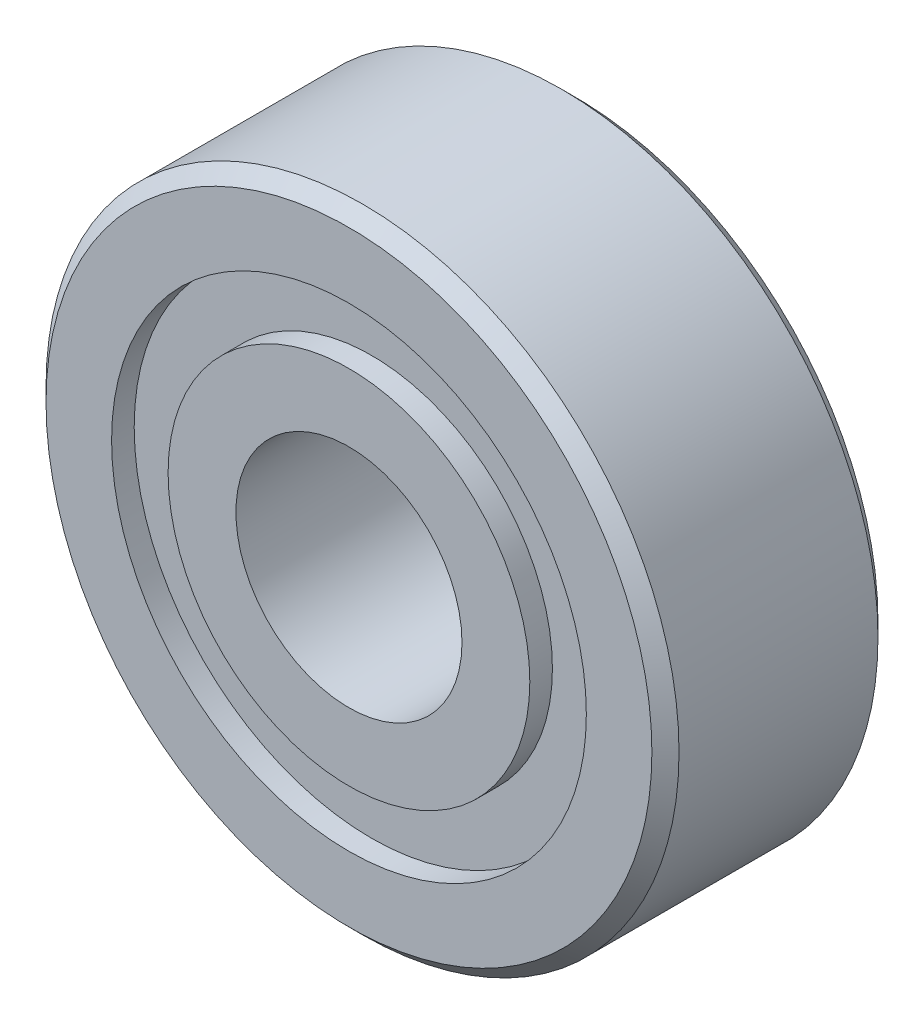
ISO-10303-21;
HEADER;
FILE_DESCRIPTION(('STEP AP214'),'2;1');
FILE_NAME('part.step','',(''),(''),'','','');
FILE_SCHEMA(('AUTOMOTIVE_DESIGN { 1 0 10303 214 1 1 1 1 }'));
ENDSEC;
DATA;
#1=APPLICATION_CONTEXT('core data for automotive mechanical design processes');
#2=APPLICATION_PROTOCOL_DEFINITION('international standard','automotive_design',2000,#1);
#3=PRODUCT_CONTEXT('',#1,'mechanical');
#4=PRODUCT('Part','Part','',(#3));
#5=PRODUCT_RELATED_PRODUCT_CATEGORY('part','',(#4));
#6=PRODUCT_DEFINITION_FORMATION('','',#4);
#7=PRODUCT_DEFINITION_CONTEXT('part definition',#1,'design');
#8=PRODUCT_DEFINITION('design','',#6,#7);
#9=PRODUCT_DEFINITION_SHAPE('','',#8);
#10=(LENGTH_UNIT() NAMED_UNIT(*) SI_UNIT(.MILLI.,.METRE.));
#11=(NAMED_UNIT(*) PLANE_ANGLE_UNIT() SI_UNIT($,.RADIAN.));
#12=(NAMED_UNIT(*) SI_UNIT($,.STERADIAN.) SOLID_ANGLE_UNIT());
#13=UNCERTAINTY_MEASURE_WITH_UNIT(LENGTH_MEASURE(1.E-05),#10,'distance_accuracy_value','');
#14=(GEOMETRIC_REPRESENTATION_CONTEXT(3) GLOBAL_UNCERTAINTY_ASSIGNED_CONTEXT((#13)) GLOBAL_UNIT_ASSIGNED_CONTEXT((#10,
#11,#12)) REPRESENTATION_CONTEXT('',''));
#15=CARTESIAN_POINT('',(0.,0.,0.));
#16=DIRECTION('',(0.,0.,1.));
#17=DIRECTION('',(1.,0.,0.));
#18=AXIS2_PLACEMENT_3D('',#15,#16,#17);
#19=CARTESIAN_POINT('',(0.,0.,0.));
#20=DIRECTION('',(0.,0.,1.));
#21=DIRECTION('',(1.,0.,0.));
#22=AXIS2_PLACEMENT_3D('',#19,#20,#21);
#23=PLANE('',#22);
#24=CARTESIAN_POINT('',(0.,0.,0.));
#25=DIRECTION('',(0.,0.,1.));
#26=DIRECTION('',(1.,0.,0.));
#27=AXIS2_PLACEMENT_3D('',#24,#25,#26);
#28=CIRCLE('',#27,2.5);
#29=CARTESIAN_POINT('',(2.5,0.,0.));
#30=VERTEX_POINT('',#29);
#31=EDGE_CURVE('E55',#30,#30,#28,.T.);
#32=ORIENTED_EDGE('',*,*,#31,.T.);
#33=EDGE_LOOP('',(#32));
#34=FACE_BOUND('',#33,.T.);
#35=CARTESIAN_POINT('',(0.,0.,0.));
#36=DIRECTION('',(0.,0.,-1.));
#37=DIRECTION('',(-1.,0.,0.));
#38=AXIS2_PLACEMENT_3D('',#35,#36,#37);
#39=CIRCLE('',#38,4.);
#40=CARTESIAN_POINT('',(-4.,0.,0.));
#41=VERTEX_POINT('',#40);
#42=EDGE_CURVE('E79',#41,#41,#39,.T.);
#43=ORIENTED_EDGE('',*,*,#42,.T.);
#44=EDGE_LOOP('',(#43));
#45=FACE_BOUND('',#44,.T.);
#46=ADVANCED_FACE('F33',(#34,#45),#23,.F.);
#47=CARTESIAN_POINT('',(0.,0.,5.));
#48=DIRECTION('',(0.,0.,1.));
#49=DIRECTION('',(1.,0.,0.));
#50=AXIS2_PLACEMENT_3D('',#47,#48,#49);
#51=PLANE('',#50);
#52=CARTESIAN_POINT('',(0.,0.,5.));
#53=DIRECTION('',(0.,0.,1.));
#54=DIRECTION('',(1.,0.,0.));
#55=AXIS2_PLACEMENT_3D('',#52,#53,#54);
#56=CIRCLE('',#55,2.5);
#57=CARTESIAN_POINT('',(2.5,0.,5.));
#58=VERTEX_POINT('',#57);
#59=EDGE_CURVE('E54',#58,#58,#56,.T.);
#60=ORIENTED_EDGE('',*,*,#59,.F.);
#61=EDGE_LOOP('',(#60));
#62=FACE_BOUND('',#61,.T.);
#63=CARTESIAN_POINT('',(0.,0.,5.));
#64=DIRECTION('',(0.,0.,1.));
#65=DIRECTION('',(1.,0.,0.));
#66=AXIS2_PLACEMENT_3D('',#63,#64,#65);
#67=CIRCLE('',#66,4.);
#68=CARTESIAN_POINT('',(4.,0.,5.));
#69=VERTEX_POINT('',#68);
#70=EDGE_CURVE('E67',#69,#69,#67,.T.);
#71=ORIENTED_EDGE('',*,*,#70,.T.);
#72=EDGE_LOOP('',(#71));
#73=FACE_BOUND('',#72,.T.);
#74=ADVANCED_FACE('F112',(#62,#73),#51,.T.);
#75=CARTESIAN_POINT('',(0.,0.,5.));
#76=DIRECTION('',(0.,0.,1.));
#77=DIRECTION('',(1.,0.,0.));
#78=AXIS2_PLACEMENT_3D('',#75,#76,#77);
#79=CIRCLE('',#78,6.7);
#80=CARTESIAN_POINT('',(6.7,0.,5.));
#81=VERTEX_POINT('',#80);
#82=EDGE_CURVE('E49',#81,#81,#79,.T.);
#83=ORIENTED_EDGE('',*,*,#82,.T.);
#84=EDGE_LOOP('',(#83));
#85=FACE_BOUND('',#84,.T.);
#86=CARTESIAN_POINT('',(0.,0.,5.));
#87=DIRECTION('',(0.,0.,1.));
#88=DIRECTION('',(1.,0.,0.));
#89=AXIS2_PLACEMENT_3D('',#86,#87,#88);
#90=CIRCLE('',#89,5.25);
#91=CARTESIAN_POINT('',(5.25,0.,5.));
#92=VERTEX_POINT('',#91);
#93=EDGE_CURVE('E61',#92,#92,#90,.T.);
#94=ORIENTED_EDGE('',*,*,#93,.F.);
#95=EDGE_LOOP('',(#94));
#96=FACE_BOUND('',#95,.T.);
#97=ADVANCED_FACE('F104',(#85,#96),#51,.T.);
#98=CARTESIAN_POINT('',(0.,0.,0.));
#99=DIRECTION('',(0.,0.,1.));
#100=DIRECTION('',(1.,0.,0.));
#101=AXIS2_PLACEMENT_3D('',#98,#99,#100);
#102=CIRCLE('',#101,6.7);
#103=CARTESIAN_POINT('',(6.7,0.,0.));
#104=VERTEX_POINT('',#103);
#105=EDGE_CURVE('E10',#104,#104,#102,.F.);
#106=ORIENTED_EDGE('',*,*,#105,.T.);
#107=EDGE_LOOP('',(#106));
#108=FACE_BOUND('',#107,.T.);
#109=CARTESIAN_POINT('',(0.,0.,0.));
#110=DIRECTION('',(0.,0.,-1.));
#111=DIRECTION('',(-1.,0.,0.));
#112=AXIS2_PLACEMENT_3D('',#109,#110,#111);
#113=CIRCLE('',#112,5.25);
#114=CARTESIAN_POINT('',(-5.25,0.,0.));
#115=VERTEX_POINT('',#114);
#116=EDGE_CURVE('E73',#115,#115,#113,.T.);
#117=ORIENTED_EDGE('',*,*,#116,.F.);
#118=EDGE_LOOP('',(#117));
#119=FACE_BOUND('',#118,.T.);
#120=ADVANCED_FACE('F101',(#108,#119),#23,.F.);
#121=CARTESIAN_POINT('',(0.,0.,5.));
#122=DIRECTION('',(0.,0.,-1.));
#123=DIRECTION('',(-1.,0.,0.));
#124=AXIS2_PLACEMENT_3D('',#121,#122,#123);
#125=CYLINDRICAL_SURFACE('',#124,7.);
#126=CARTESIAN_POINT('',(0.,0.,4.7));
#127=DIRECTION('',(0.,0.,1.));
#128=DIRECTION('',(1.,0.,0.));
#129=AXIS2_PLACEMENT_3D('',#126,#127,#128);
#130=CIRCLE('',#129,7.);
#131=CARTESIAN_POINT('',(7.,0.,4.7));
#132=VERTEX_POINT('',#131);
#133=EDGE_CURVE('E41',#132,#132,#130,.F.);
#134=ORIENTED_EDGE('',*,*,#133,.T.);
#135=EDGE_LOOP('',(#134));
#136=FACE_BOUND('',#135,.T.);
#137=CARTESIAN_POINT('',(0.,0.,0.300000000000003));
#138=DIRECTION('',(0.,0.,1.));
#139=DIRECTION('',(1.,0.,0.));
#140=AXIS2_PLACEMENT_3D('',#137,#138,#139);
#141=CIRCLE('',#140,7.);
#142=CARTESIAN_POINT('',(7.,0.,0.300000000000003));
#143=VERTEX_POINT('',#142);
#144=EDGE_CURVE('E45',#143,#143,#141,.T.);
#145=ORIENTED_EDGE('',*,*,#144,.T.);
#146=EDGE_LOOP('',(#145));
#147=FACE_BOUND('',#146,.T.);
#148=ADVANCED_FACE('F103',(#136,#147),#125,.T.);
#149=CARTESIAN_POINT('',(0.,0.,5.));
#150=DIRECTION('',(0.,0.,-1.));
#151=DIRECTION('',(-1.,0.,0.));
#152=AXIS2_PLACEMENT_3D('',#149,#150,#151);
#153=CYLINDRICAL_SURFACE('',#152,2.5);
#154=ORIENTED_EDGE('',*,*,#59,.T.);
#155=EDGE_LOOP('',(#154));
#156=FACE_BOUND('',#155,.T.);
#157=ORIENTED_EDGE('',*,*,#31,.F.);
#158=EDGE_LOOP('',(#157));
#159=FACE_BOUND('',#158,.T.);
#160=ADVANCED_FACE('F110',(#156,#159),#153,.F.);
#161=CARTESIAN_POINT('',(0.,0.,4.5));
#162=DIRECTION('',(0.,0.,1.));
#163=DIRECTION('',(1.,0.,0.));
#164=AXIS2_PLACEMENT_3D('',#161,#162,#163);
#165=CYLINDRICAL_SURFACE('',#164,5.25);
#166=CARTESIAN_POINT('',(0.,0.,4.5));
#167=DIRECTION('',(0.,0.,1.));
#168=DIRECTION('',(1.,0.,0.));
#169=AXIS2_PLACEMENT_3D('',#166,#167,#168);
#170=CIRCLE('',#169,5.25);
#171=CARTESIAN_POINT('',(5.25,0.,4.5));
#172=VERTEX_POINT('',#171);
#173=EDGE_CURVE('E58',#172,#172,#170,.T.);
#174=ORIENTED_EDGE('',*,*,#173,.F.);
#175=EDGE_LOOP('',(#174));
#176=FACE_BOUND('',#175,.T.);
#177=ORIENTED_EDGE('',*,*,#93,.T.);
#178=EDGE_LOOP('',(#177));
#179=FACE_BOUND('',#178,.T.);
#180=ADVANCED_FACE('F138',(#176,#179),#165,.F.);
#181=CARTESIAN_POINT('',(0.,0.,4.5));
#182=DIRECTION('',(0.,0.,1.));
#183=DIRECTION('',(1.,0.,0.));
#184=AXIS2_PLACEMENT_3D('',#181,#182,#183);
#185=PLANE('',#184);
#186=CARTESIAN_POINT('',(0.,0.,4.5));
#187=DIRECTION('',(0.,0.,1.));
#188=DIRECTION('',(1.,0.,0.));
#189=AXIS2_PLACEMENT_3D('',#186,#187,#188);
#190=CIRCLE('',#189,4.);
#191=CARTESIAN_POINT('',(4.,0.,4.5));
#192=VERTEX_POINT('',#191);
#193=EDGE_CURVE('E64',#192,#192,#190,.T.);
#194=ORIENTED_EDGE('',*,*,#193,.F.);
#195=EDGE_LOOP('',(#194));
#196=FACE_BOUND('',#195,.T.);
#197=ORIENTED_EDGE('',*,*,#173,.T.);
#198=EDGE_LOOP('',(#197));
#199=FACE_BOUND('',#198,.T.);
#200=ADVANCED_FACE('F134',(#196,#199),#185,.T.);
#201=CARTESIAN_POINT('',(0.,0.,4.5));
#202=DIRECTION('',(0.,0.,1.));
#203=DIRECTION('',(1.,0.,0.));
#204=AXIS2_PLACEMENT_3D('',#201,#202,#203);
#205=CYLINDRICAL_SURFACE('',#204,4.);
#206=ORIENTED_EDGE('',*,*,#193,.T.);
#207=EDGE_LOOP('',(#206));
#208=FACE_BOUND('',#207,.T.);
#209=ORIENTED_EDGE('',*,*,#70,.F.);
#210=EDGE_LOOP('',(#209));
#211=FACE_BOUND('',#210,.T.);
#212=ADVANCED_FACE('F97',(#208,#211),#205,.T.);
#213=CARTESIAN_POINT('',(0.,0.,0.5));
#214=DIRECTION('',(0.,0.,-1.));
#215=DIRECTION('',(-1.,0.,0.));
#216=AXIS2_PLACEMENT_3D('',#213,#214,#215);
#217=CYLINDRICAL_SURFACE('',#216,5.25);
#218=CARTESIAN_POINT('',(0.,0.,0.5));
#219=DIRECTION('',(0.,0.,-1.));
#220=DIRECTION('',(-1.,0.,0.));
#221=AXIS2_PLACEMENT_3D('',#218,#219,#220);
#222=CIRCLE('',#221,5.25);
#223=CARTESIAN_POINT('',(-5.25,0.,0.5));
#224=VERTEX_POINT('',#223);
#225=EDGE_CURVE('E70',#224,#224,#222,.T.);
#226=ORIENTED_EDGE('',*,*,#225,.F.);
#227=EDGE_LOOP('',(#226));
#228=FACE_BOUND('',#227,.T.);
#229=ORIENTED_EDGE('',*,*,#116,.T.);
#230=EDGE_LOOP('',(#229));
#231=FACE_BOUND('',#230,.T.);
#232=ADVANCED_FACE('F91',(#228,#231),#217,.F.);
#233=CARTESIAN_POINT('',(0.,0.,0.5));
#234=DIRECTION('',(0.,0.,-1.));
#235=DIRECTION('',(-1.,0.,0.));
#236=AXIS2_PLACEMENT_3D('',#233,#234,#235);
#237=PLANE('',#236);
#238=CARTESIAN_POINT('',(0.,0.,0.5));
#239=DIRECTION('',(0.,0.,-1.));
#240=DIRECTION('',(-1.,0.,0.));
#241=AXIS2_PLACEMENT_3D('',#238,#239,#240);
#242=CIRCLE('',#241,4.);
#243=CARTESIAN_POINT('',(-4.,0.,0.5));
#244=VERTEX_POINT('',#243);
#245=EDGE_CURVE('E76',#244,#244,#242,.T.);
#246=ORIENTED_EDGE('',*,*,#245,.F.);
#247=EDGE_LOOP('',(#246));
#248=FACE_BOUND('',#247,.T.);
#249=ORIENTED_EDGE('',*,*,#225,.T.);
#250=EDGE_LOOP('',(#249));
#251=FACE_BOUND('',#250,.T.);
#252=ADVANCED_FACE('F88',(#248,#251),#237,.T.);
#253=CARTESIAN_POINT('',(0.,0.,0.5));
#254=DIRECTION('',(0.,0.,-1.));
#255=DIRECTION('',(-1.,0.,0.));
#256=AXIS2_PLACEMENT_3D('',#253,#254,#255);
#257=CYLINDRICAL_SURFACE('',#256,4.);
#258=ORIENTED_EDGE('',*,*,#245,.T.);
#259=EDGE_LOOP('',(#258));
#260=FACE_BOUND('',#259,.T.);
#261=ORIENTED_EDGE('',*,*,#42,.F.);
#262=EDGE_LOOP('',(#261));
#263=FACE_BOUND('',#262,.T.);
#264=ADVANCED_FACE('F85',(#260,#263),#257,.T.);
#265=CARTESIAN_POINT('',(0.,0.,5.));
#266=DIRECTION('',(0.,0.,-1.));
#267=DIRECTION('',(-1.,0.,0.));
#268=AXIS2_PLACEMENT_3D('',#265,#266,#267);
#269=CONICAL_SURFACE('',#268,6.7,0.785398163397453);
#270=ORIENTED_EDGE('',*,*,#133,.F.);
#271=EDGE_LOOP('',(#270));
#272=FACE_BOUND('',#271,.T.);
#273=ORIENTED_EDGE('',*,*,#82,.F.);
#274=EDGE_LOOP('',(#273));
#275=FACE_BOUND('',#274,.T.);
#276=ADVANCED_FACE('F125',(#272,#275),#269,.T.);
#277=CARTESIAN_POINT('',(0.,0.,0.300000000000003));
#278=DIRECTION('',(0.,0.,1.));
#279=DIRECTION('',(1.,0.,0.));
#280=AXIS2_PLACEMENT_3D('',#277,#278,#279);
#281=CONICAL_SURFACE('',#280,7.,0.78539816339745);
#282=ORIENTED_EDGE('',*,*,#105,.F.);
#283=EDGE_LOOP('',(#282));
#284=FACE_BOUND('',#283,.T.);
#285=ORIENTED_EDGE('',*,*,#144,.F.);
#286=EDGE_LOOP('',(#285));
#287=FACE_BOUND('',#286,.T.);
#288=ADVANCED_FACE('F36',(#284,#287),#281,.T.);
#289=CLOSED_SHELL('',(#46,#74,#97,#120,#148,#160,#180,#200,#212,#232,#252,#264,#276,#288));
#290=MANIFOLD_SOLID_BREP('B2',#289);
#291=ADVANCED_BREP_SHAPE_REPRESENTATION('',(#18,#290),#14);
#292=SHAPE_DEFINITION_REPRESENTATION(#9,#291);
ENDSEC;
END-ISO-10303-21;
